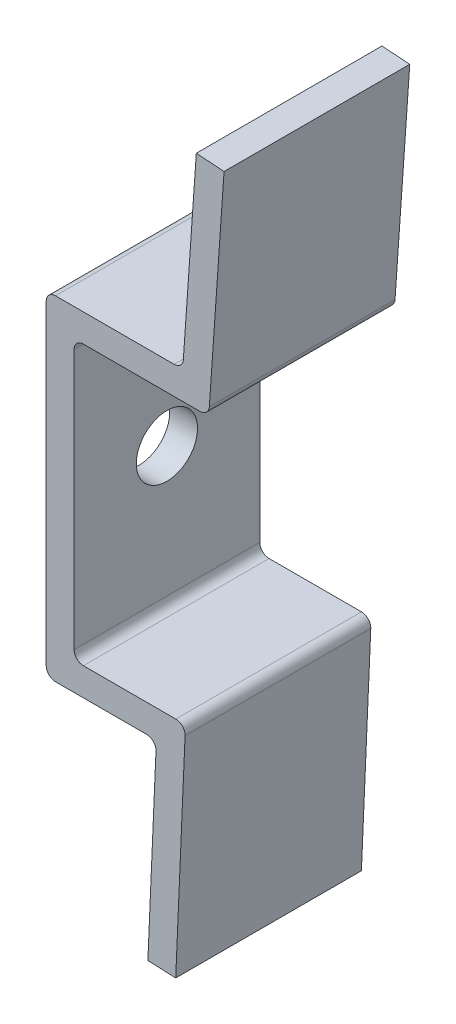
ISO-10303-21;
HEADER;
FILE_DESCRIPTION(('STEP AP214'),'2;1');
FILE_NAME('part.step','',(''),(''),'','','');
FILE_SCHEMA(('AUTOMOTIVE_DESIGN { 1 0 10303 214 1 1 1 1 }'));
ENDSEC;
DATA;
#1=APPLICATION_CONTEXT('core data for automotive mechanical design processes');
#2=APPLICATION_PROTOCOL_DEFINITION('international standard','automotive_design',2000,#1);
#3=PRODUCT_CONTEXT('',#1,'mechanical');
#4=PRODUCT('Part','Part','',(#3));
#5=PRODUCT_RELATED_PRODUCT_CATEGORY('part','',(#4));
#6=PRODUCT_DEFINITION_FORMATION('','',#4);
#7=PRODUCT_DEFINITION_CONTEXT('part definition',#1,'design');
#8=PRODUCT_DEFINITION('design','',#6,#7);
#9=PRODUCT_DEFINITION_SHAPE('','',#8);
#10=(LENGTH_UNIT() NAMED_UNIT(*) SI_UNIT(.MILLI.,.METRE.));
#11=(NAMED_UNIT(*) PLANE_ANGLE_UNIT() SI_UNIT($,.RADIAN.));
#12=(NAMED_UNIT(*) SI_UNIT($,.STERADIAN.) SOLID_ANGLE_UNIT());
#13=UNCERTAINTY_MEASURE_WITH_UNIT(LENGTH_MEASURE(1.E-05),#10,'distance_accuracy_value','');
#14=(GEOMETRIC_REPRESENTATION_CONTEXT(3) GLOBAL_UNCERTAINTY_ASSIGNED_CONTEXT((#13)) GLOBAL_UNIT_ASSIGNED_CONTEXT((#10,
#11,#12)) REPRESENTATION_CONTEXT('',''));
#15=CARTESIAN_POINT('',(0.,0.,0.));
#16=DIRECTION('',(0.,0.,1.));
#17=DIRECTION('',(1.,0.,0.));
#18=AXIS2_PLACEMENT_3D('',#15,#16,#17);
#19=CARTESIAN_POINT('',(10.9482059619883,-39.0245838190026,-9.99999999999998));
#20=DIRECTION('',(-0.0436193873653363,-0.999048221581858,0.));
#21=DIRECTION('',(0.999048221581857,-0.0436193873653405,0.));
#22=AXIS2_PLACEMENT_3D('',#19,#20,#21);
#23=PLANE('',#22);
#24=DIRECTION('',(0.,0.,0.99999999999999));
#25=VECTOR('',#24,1.);
#26=CARTESIAN_POINT('',(13.9453506267337,-39.1554419810987,-10.0000000000002));
#27=LINE('',#26,#25);
#28=CARTESIAN_POINT('',(13.9453506267337,-39.1554419810987,-10.0000000000002));
#29=VERTEX_POINT('',#28);
#30=CARTESIAN_POINT('',(13.9453506267342,-39.1554419810985,9.99999999999976));
#31=VERTEX_POINT('',#30);
#32=EDGE_CURVE('E37',#29,#31,#27,.T.);
#33=ORIENTED_EDGE('',*,*,#32,.T.);
#34=DIRECTION('',(0.999048221581857,-0.0436193873653405,0.));
#35=VECTOR('',#34,1.);
#36=CARTESIAN_POINT('',(10.9482059619881,-39.0245838190023,9.99999999999965));
#37=LINE('',#36,#35);
#38=CARTESIAN_POINT('',(10.9482059619881,-39.0245838190023,9.99999999999965));
#39=VERTEX_POINT('',#38);
#40=EDGE_CURVE('E170',#39,#31,#37,.T.);
#41=ORIENTED_EDGE('',*,*,#40,.F.);
#42=DIRECTION('',(0.,0.,0.99999999999999));
#43=VECTOR('',#42,1.);
#44=CARTESIAN_POINT('',(10.9482059619883,-39.0245838190026,-9.99999999999998));
#45=LINE('',#44,#43);
#46=CARTESIAN_POINT('',(10.9482059619883,-39.0245838190026,-9.99999999999998));
#47=VERTEX_POINT('',#46);
#48=EDGE_CURVE('E11',#47,#39,#45,.T.);
#49=ORIENTED_EDGE('',*,*,#48,.F.);
#50=DIRECTION('',(0.999048221581857,-0.0436193873653405,0.));
#51=VECTOR('',#50,1.);
#52=CARTESIAN_POINT('',(10.9482059619883,-39.0245838190026,-9.99999999999998));
#53=LINE('',#52,#51);
#54=EDGE_CURVE('E171',#47,#29,#53,.T.);
#55=ORIENTED_EDGE('',*,*,#54,.T.);
#56=EDGE_LOOP('',(#33,#41,#49,#55));
#57=FACE_BOUND('',#56,.T.);
#58=ADVANCED_FACE('F34',(#57),#23,.T.);
#59=CARTESIAN_POINT('',(11.8205937092951,-19.0436193873657,-10.0000000000003));
#60=DIRECTION('',(-0.999048221581856,0.0436193873653425,0.));
#61=DIRECTION('',(-0.0436193873653374,-0.999048221581858,0.));
#62=AXIS2_PLACEMENT_3D('',#59,#60,#61);
#63=PLANE('',#62);
#64=ORIENTED_EDGE('',*,*,#48,.T.);
#65=DIRECTION('',(-0.0436193873653374,-0.999048221581858,0.));
#66=VECTOR('',#65,1.);
#67=CARTESIAN_POINT('',(11.8205937092952,-19.0436193873655,9.99999999999954));
#68=LINE('',#67,#66);
#69=CARTESIAN_POINT('',(11.8205937092952,-19.0436193873655,9.99999999999954));
#70=VERTEX_POINT('',#69);
#71=EDGE_CURVE('E188',#70,#39,#68,.T.);
#72=ORIENTED_EDGE('',*,*,#71,.F.);
#73=DIRECTION('',(0.,0.,0.99999999999999));
#74=VECTOR('',#73,1.);
#75=CARTESIAN_POINT('',(11.8205937092951,-19.0436193873657,-10.0000000000003));
#76=LINE('',#75,#74);
#77=CARTESIAN_POINT('',(11.8205937092951,-19.0436193873657,-10.0000000000003));
#78=VERTEX_POINT('',#77);
#79=EDGE_CURVE('E42',#78,#70,#76,.T.);
#80=ORIENTED_EDGE('',*,*,#79,.F.);
#81=DIRECTION('',(-0.0436193873653374,-0.999048221581858,0.));
#82=VECTOR('',#81,1.);
#83=CARTESIAN_POINT('',(11.8205937092951,-19.0436193873657,-10.0000000000003));
#84=LINE('',#83,#82);
#85=EDGE_CURVE('E176',#78,#47,#84,.T.);
#86=ORIENTED_EDGE('',*,*,#85,.T.);
#87=EDGE_LOOP('',(#64,#72,#80,#86));
#88=FACE_BOUND('',#87,.T.);
#89=ADVANCED_FACE('F401',(#88),#63,.T.);
#90=CARTESIAN_POINT('',(10.821545487713,-19.0000000000003,-10.0000000000005));
#91=DIRECTION('',(0.,0.,0.99999999999999));
#92=DIRECTION('',(0.999999999999999,0.,0.));
#93=AXIS2_PLACEMENT_3D('',#90,#91,#92);
#94=CYLINDRICAL_SURFACE('',#93,1.);
#95=ORIENTED_EDGE('',*,*,#79,.T.);
#96=CARTESIAN_POINT('',(10.8215454877133,-19.0000000000001,9.99999999999943));
#97=DIRECTION('',(0.,0.,-0.99999999999999));
#98=DIRECTION('',(-0.999999999999999,0.,0.));
#99=AXIS2_PLACEMENT_3D('',#96,#97,#98);
#100=CIRCLE('',#99,1.);
#101=CARTESIAN_POINT('',(10.8215454877132,-18.0000000000001,9.9999999999992));
#102=VERTEX_POINT('',#101);
#103=EDGE_CURVE('E242',#102,#70,#100,.T.);
#104=ORIENTED_EDGE('',*,*,#103,.F.);
#105=DIRECTION('',(0.,0.,0.99999999999999));
#106=VECTOR('',#105,1.);
#107=CARTESIAN_POINT('',(10.8215454877129,-18.0000000000002,-10.0000000000004));
#108=LINE('',#107,#106);
#109=CARTESIAN_POINT('',(10.8215454877129,-18.0000000000002,-10.0000000000004));
#110=VERTEX_POINT('',#109);
#111=EDGE_CURVE('E300',#110,#102,#108,.T.);
#112=ORIENTED_EDGE('',*,*,#111,.F.);
#113=CARTESIAN_POINT('',(10.821545487713,-19.0000000000003,-10.0000000000005));
#114=DIRECTION('',(0.,0.,-0.99999999999999));
#115=DIRECTION('',(-0.999999999999999,0.,0.));
#116=AXIS2_PLACEMENT_3D('',#113,#114,#115);
#117=CIRCLE('',#116,1.);
#118=EDGE_CURVE('E296',#110,#78,#117,.T.);
#119=ORIENTED_EDGE('',*,*,#118,.T.);
#120=EDGE_LOOP('',(#95,#104,#112,#119));
#121=FACE_BOUND('',#120,.T.);
#122=ADVANCED_FACE('F400',(#121),#94,.F.);
#123=CARTESIAN_POINT('',(1.00000000000067,-18.0000000000004,-10.0000000000005));
#124=DIRECTION('',(0.,-1.,0.));
#125=DIRECTION('',(0.999999999999998,0.,0.));
#126=AXIS2_PLACEMENT_3D('',#123,#124,#125);
#127=PLANE('',#126);
#128=ORIENTED_EDGE('',*,*,#111,.T.);
#129=DIRECTION('',(0.999999999999998,0.,0.));
#130=VECTOR('',#129,1.);
#131=CARTESIAN_POINT('',(1.00000000000056,-18.,9.9999999999997));
#132=LINE('',#131,#130);
#133=CARTESIAN_POINT('',(1.00000000000056,-18.,9.9999999999997));
#134=VERTEX_POINT('',#133);
#135=EDGE_CURVE('E239',#134,#102,#132,.T.);
#136=ORIENTED_EDGE('',*,*,#135,.F.);
#137=DIRECTION('',(0.,0.,0.99999999999999));
#138=VECTOR('',#137,1.);
#139=CARTESIAN_POINT('',(1.00000000000067,-18.0000000000004,-10.0000000000005));
#140=LINE('',#139,#138);
#141=CARTESIAN_POINT('',(1.00000000000067,-18.0000000000004,-10.0000000000005));
#142=VERTEX_POINT('',#141);
#143=EDGE_CURVE('E302',#142,#134,#140,.T.);
#144=ORIENTED_EDGE('',*,*,#143,.F.);
#145=DIRECTION('',(0.999999999999998,0.,0.));
#146=VECTOR('',#145,1.);
#147=CARTESIAN_POINT('',(1.00000000000067,-18.0000000000004,-10.0000000000005));
#148=LINE('',#147,#146);
#149=EDGE_CURVE('E293',#142,#110,#148,.T.);
#150=ORIENTED_EDGE('',*,*,#149,.T.);
#151=EDGE_LOOP('',(#128,#136,#144,#150));
#152=FACE_BOUND('',#151,.T.);
#153=ADVANCED_FACE('F396',(#152),#127,.T.);
#154=CARTESIAN_POINT('',(1.00000000000078,-17.0000000000006,-10.0000000000008));
#155=DIRECTION('',(0.,0.,0.99999999999999));
#156=DIRECTION('',(0.999999999999999,0.,0.));
#157=AXIS2_PLACEMENT_3D('',#154,#155,#156);
#158=CYLINDRICAL_SURFACE('',#157,1.);
#159=ORIENTED_EDGE('',*,*,#143,.T.);
#160=CARTESIAN_POINT('',(1.00000000000039,-17.0000000000001,9.99999999999979));
#161=DIRECTION('',(0.,0.,0.99999999999999));
#162=DIRECTION('',(0.999999999999999,0.,0.));
#163=AXIS2_PLACEMENT_3D('',#160,#161,#162);
#164=CIRCLE('',#163,1.);
#165=CARTESIAN_POINT('',(6.10622663543836E-13,-17.0000000000003,9.99999999999954));
#166=VERTEX_POINT('',#165);
#167=EDGE_CURVE('E236',#166,#134,#164,.T.);
#168=ORIENTED_EDGE('',*,*,#167,.F.);
#169=DIRECTION('',(0.,0.,0.99999999999999));
#170=VECTOR('',#169,1.);
#171=CARTESIAN_POINT('',(3.33066907387547E-13,-17.0000000000003,-10.0000000000002));
#172=LINE('',#171,#170);
#173=CARTESIAN_POINT('',(3.33066907387547E-13,-17.0000000000003,-10.0000000000002));
#174=VERTEX_POINT('',#173);
#175=EDGE_CURVE('E304',#174,#166,#172,.T.);
#176=ORIENTED_EDGE('',*,*,#175,.F.);
#177=CARTESIAN_POINT('',(1.00000000000078,-17.0000000000006,-10.0000000000008));
#178=DIRECTION('',(0.,0.,0.99999999999999));
#179=DIRECTION('',(0.999999999999999,0.,0.));
#180=AXIS2_PLACEMENT_3D('',#177,#178,#179);
#181=CIRCLE('',#180,1.);
#182=EDGE_CURVE('E290',#174,#142,#181,.T.);
#183=ORIENTED_EDGE('',*,*,#182,.T.);
#184=EDGE_LOOP('',(#159,#168,#176,#183));
#185=FACE_BOUND('',#184,.T.);
#186=ADVANCED_FACE('F391',(#185),#158,.T.);
#187=CARTESIAN_POINT('',(2.22044604925031E-13,16.9999999999996,-10.0000000000001));
#188=DIRECTION('',(-0.999999999999998,0.,0.));
#189=DIRECTION('',(0.,-1.,0.));
#190=AXIS2_PLACEMENT_3D('',#187,#188,#189);
#191=PLANE('',#190);
#192=CARTESIAN_POINT('',(0.,0.,0.));
#193=DIRECTION('',(-0.999999999999999,0.,0.));
#194=DIRECTION('',(0.,0.,0.99999999999999));
#195=AXIS2_PLACEMENT_3D('',#192,#193,#194);
#196=CIRCLE('',#195,3.29999999999989);
#197=CARTESIAN_POINT('',(0.,0.,3.29999999999991));
#198=VERTEX_POINT('',#197);
#199=EDGE_CURVE('E192',#198,#198,#196,.T.);
#200=ORIENTED_EDGE('',*,*,#199,.F.);
#201=EDGE_LOOP('',(#200));
#202=FACE_BOUND('',#201,.T.);
#203=ORIENTED_EDGE('',*,*,#175,.T.);
#204=DIRECTION('',(0.,-1.,0.));
#205=VECTOR('',#204,1.);
#206=CARTESIAN_POINT('',(3.88578058618805E-13,16.9999999999991,9.99999999999937));
#207=LINE('',#206,#205);
#208=CARTESIAN_POINT('',(3.88578058618805E-13,16.9999999999991,9.99999999999937));
#209=VERTEX_POINT('',#208);
#210=EDGE_CURVE('E233',#209,#166,#207,.T.);
#211=ORIENTED_EDGE('',*,*,#210,.F.);
#212=DIRECTION('',(0.,0.,0.99999999999999));
#213=VECTOR('',#212,1.);
#214=CARTESIAN_POINT('',(2.22044604925031E-13,16.9999999999996,-10.0000000000001));
#215=LINE('',#214,#213);
#216=CARTESIAN_POINT('',(2.22044604925031E-13,16.9999999999996,-10.0000000000001));
#217=VERTEX_POINT('',#216);
#218=EDGE_CURVE('E306',#217,#209,#215,.T.);
#219=ORIENTED_EDGE('',*,*,#218,.F.);
#220=DIRECTION('',(0.,-1.,0.));
#221=VECTOR('',#220,1.);
#222=CARTESIAN_POINT('',(2.22044604925031E-13,16.9999999999996,-10.0000000000001));
#223=LINE('',#222,#221);
#224=EDGE_CURVE('E287',#217,#174,#223,.T.);
#225=ORIENTED_EDGE('',*,*,#224,.T.);
#226=EDGE_LOOP('',(#203,#211,#219,#225));
#227=FACE_BOUND('',#226,.T.);
#228=ADVANCED_FACE('F389',(#202,#227),#191,.T.);
#229=CARTESIAN_POINT('',(1.00000000000061,16.9999999999998,-10.0000000000004));
#230=DIRECTION('',(0.,0.,0.99999999999999));
#231=DIRECTION('',(0.999999999999999,0.,0.));
#232=AXIS2_PLACEMENT_3D('',#229,#230,#231);
#233=CYLINDRICAL_SURFACE('',#232,1.);
#234=ORIENTED_EDGE('',*,*,#218,.T.);
#235=CARTESIAN_POINT('',(1.00000000000022,16.9999999999995,9.99999999999948));
#236=DIRECTION('',(0.,0.,0.99999999999999));
#237=DIRECTION('',(-0.999999999999999,0.,0.));
#238=AXIS2_PLACEMENT_3D('',#235,#236,#237);
#239=CIRCLE('',#238,1.);
#240=CARTESIAN_POINT('',(1.000000000001,17.9999999999997,9.99999999999943));
#241=VERTEX_POINT('',#240);
#242=EDGE_CURVE('E230',#241,#209,#239,.T.);
#243=ORIENTED_EDGE('',*,*,#242,.F.);
#244=DIRECTION('',(0.,0.,0.99999999999999));
#245=VECTOR('',#244,1.);
#246=CARTESIAN_POINT('',(1.00000000000056,17.9999999999993,-9.99999999999993));
#247=LINE('',#246,#245);
#248=CARTESIAN_POINT('',(1.00000000000056,17.9999999999993,-9.99999999999993));
#249=VERTEX_POINT('',#248);
#250=EDGE_CURVE('E308',#249,#241,#247,.T.);
#251=ORIENTED_EDGE('',*,*,#250,.F.);
#252=CARTESIAN_POINT('',(1.00000000000061,16.9999999999998,-10.0000000000004));
#253=DIRECTION('',(0.,0.,0.99999999999999));
#254=DIRECTION('',(-0.999999999999999,0.,0.));
#255=AXIS2_PLACEMENT_3D('',#252,#253,#254);
#256=CIRCLE('',#255,1.);
#257=EDGE_CURVE('E284',#249,#217,#256,.T.);
#258=ORIENTED_EDGE('',*,*,#257,.T.);
#259=EDGE_LOOP('',(#234,#243,#251,#258));
#260=FACE_BOUND('',#259,.T.);
#261=ADVANCED_FACE('F384',(#260),#233,.T.);
#262=CARTESIAN_POINT('',(13.7699396554494,17.9999999999996,-10.));
#263=DIRECTION('',(0.,1.,0.));
#264=DIRECTION('',(-0.999999999999998,0.,0.));
#265=AXIS2_PLACEMENT_3D('',#262,#263,#264);
#266=PLANE('',#265);
#267=ORIENTED_EDGE('',*,*,#250,.T.);
#268=DIRECTION('',(-0.999999999999998,0.,0.));
#269=VECTOR('',#268,1.);
#270=CARTESIAN_POINT('',(13.76993965545,17.9999999999994,9.99999999999998));
#271=LINE('',#270,#269);
#272=CARTESIAN_POINT('',(13.76993965545,17.9999999999994,9.99999999999998));
#273=VERTEX_POINT('',#272);
#274=EDGE_CURVE('E227',#273,#241,#271,.T.);
#275=ORIENTED_EDGE('',*,*,#274,.F.);
#276=DIRECTION('',(0.,0.,0.99999999999999));
#277=VECTOR('',#276,1.);
#278=CARTESIAN_POINT('',(13.7699396554494,17.9999999999996,-10.));
#279=LINE('',#278,#277);
#280=CARTESIAN_POINT('',(13.7699396554494,17.9999999999996,-10.));
#281=VERTEX_POINT('',#280);
#282=EDGE_CURVE('E310',#281,#273,#279,.T.);
#283=ORIENTED_EDGE('',*,*,#282,.F.);
#284=DIRECTION('',(-0.999999999999998,0.,0.));
#285=VECTOR('',#284,1.);
#286=CARTESIAN_POINT('',(13.7699396554494,17.9999999999996,-10.));
#287=LINE('',#286,#285);
#288=EDGE_CURVE('E281',#281,#249,#287,.T.);
#289=ORIENTED_EDGE('',*,*,#288,.T.);
#290=EDGE_LOOP('',(#267,#275,#283,#289));
#291=FACE_BOUND('',#290,.T.);
#292=ADVANCED_FACE('F379',(#291),#266,.T.);
#293=CARTESIAN_POINT('',(13.7699396554496,18.9999999999997,-10.0000000000001));
#294=DIRECTION('',(0.,0.,0.99999999999999));
#295=DIRECTION('',(0.999999999999999,0.,0.));
#296=AXIS2_PLACEMENT_3D('',#293,#294,#295);
#297=CYLINDRICAL_SURFACE('',#296,0.999999999999999);
#298=ORIENTED_EDGE('',*,*,#282,.T.);
#299=CARTESIAN_POINT('',(13.7699396554496,18.9999999999995,9.99999999999976));
#300=DIRECTION('',(0.,0.,-0.99999999999999));
#301=DIRECTION('',(-0.999999999999999,0.,0.));
#302=AXIS2_PLACEMENT_3D('',#299,#300,#301);
#303=CIRCLE('',#302,0.999999999999999);
#304=CARTESIAN_POINT('',(14.7675037057095,18.9302435262556,9.99999999999993));
#305=VERTEX_POINT('',#304);
#306=EDGE_CURVE('E224',#305,#273,#303,.T.);
#307=ORIENTED_EDGE('',*,*,#306,.F.);
#308=DIRECTION('',(0.,0.,0.99999999999999));
#309=VECTOR('',#308,1.);
#310=CARTESIAN_POINT('',(14.7675037057096,18.9302435262558,-10.0000000000003));
#311=LINE('',#310,#309);
#312=CARTESIAN_POINT('',(14.7675037057096,18.9302435262558,-10.0000000000003));
#313=VERTEX_POINT('',#312);
#314=EDGE_CURVE('E312',#313,#305,#311,.T.);
#315=ORIENTED_EDGE('',*,*,#314,.F.);
#316=CARTESIAN_POINT('',(13.7699396554496,18.9999999999997,-10.0000000000001));
#317=DIRECTION('',(0.,0.,-0.99999999999999));
#318=DIRECTION('',(-0.999999999999999,0.,0.));
#319=AXIS2_PLACEMENT_3D('',#316,#317,#318);
#320=CIRCLE('',#319,0.999999999999999);
#321=EDGE_CURVE('E278',#313,#281,#320,.T.);
#322=ORIENTED_EDGE('',*,*,#321,.T.);
#323=EDGE_LOOP('',(#298,#307,#315,#322));
#324=FACE_BOUND('',#323,.T.);
#325=ADVANCED_FACE('F377',(#324),#297,.F.);
#326=CARTESIAN_POINT('',(16.1626331805919,38.8815245314521,-10.0000000000002));
#327=DIRECTION('',(-0.997564050259823,0.0697564737441239,0.));
#328=DIRECTION('',(-0.0697564737441194,-0.997564050259825,0.));
#329=AXIS2_PLACEMENT_3D('',#326,#327,#328);
#330=PLANE('',#329);
#331=ORIENTED_EDGE('',*,*,#314,.T.);
#332=DIRECTION('',(-0.0697564737441194,-0.997564050259825,0.));
#333=VECTOR('',#332,1.);
#334=CARTESIAN_POINT('',(16.1626331805917,38.8815245314519,9.99999999999976));
#335=LINE('',#334,#333);
#336=CARTESIAN_POINT('',(16.1626331805917,38.8815245314519,9.99999999999976));
#337=VERTEX_POINT('',#336);
#338=EDGE_CURVE('E221',#337,#305,#335,.T.);
#339=ORIENTED_EDGE('',*,*,#338,.F.);
#340=DIRECTION('',(0.,0.,0.99999999999999));
#341=VECTOR('',#340,1.);
#342=CARTESIAN_POINT('',(16.1626331805919,38.8815245314521,-10.0000000000002));
#343=LINE('',#342,#341);
#344=CARTESIAN_POINT('',(16.1626331805919,38.8815245314521,-10.0000000000002));
#345=VERTEX_POINT('',#344);
#346=EDGE_CURVE('E314',#345,#337,#343,.T.);
#347=ORIENTED_EDGE('',*,*,#346,.F.);
#348=DIRECTION('',(-0.0697564737441194,-0.997564050259825,0.));
#349=VECTOR('',#348,1.);
#350=CARTESIAN_POINT('',(16.1626331805919,38.8815245314521,-10.0000000000002));
#351=LINE('',#350,#349);
#352=EDGE_CURVE('E275',#345,#313,#351,.T.);
#353=ORIENTED_EDGE('',*,*,#352,.T.);
#354=EDGE_LOOP('',(#331,#339,#347,#353));
#355=FACE_BOUND('',#354,.T.);
#356=ADVANCED_FACE('F372',(#355),#330,.T.);
#357=CARTESIAN_POINT('',(19.1553253313712,38.67225511022,-10.0000000000001));
#358=DIRECTION('',(0.0697564737441193,0.997564050259825,0.));
#359=DIRECTION('',(-0.997564050259823,0.0697564737441226,0.));
#360=AXIS2_PLACEMENT_3D('',#357,#358,#359);
#361=PLANE('',#360);
#362=ORIENTED_EDGE('',*,*,#346,.T.);
#363=DIRECTION('',(-0.997564050259823,0.0697564737441226,0.));
#364=VECTOR('',#363,1.);
#365=CARTESIAN_POINT('',(19.1553253313712,38.6722551102199,10.));
#366=LINE('',#365,#364);
#367=CARTESIAN_POINT('',(19.1553253313712,38.6722551102199,10.));
#368=VERTEX_POINT('',#367);
#369=EDGE_CURVE('E218',#368,#337,#366,.T.);
#370=ORIENTED_EDGE('',*,*,#369,.F.);
#371=DIRECTION('',(0.,0.,0.99999999999999));
#372=VECTOR('',#371,1.);
#373=CARTESIAN_POINT('',(19.1553253313712,38.67225511022,-10.0000000000001));
#374=LINE('',#373,#372);
#375=CARTESIAN_POINT('',(19.1553253313712,38.67225511022,-10.0000000000001));
#376=VERTEX_POINT('',#375);
#377=EDGE_CURVE('E316',#376,#368,#374,.T.);
#378=ORIENTED_EDGE('',*,*,#377,.F.);
#379=DIRECTION('',(-0.997564050259823,0.0697564737441226,0.));
#380=VECTOR('',#379,1.);
#381=CARTESIAN_POINT('',(19.1553253313712,38.67225511022,-10.0000000000001));
#382=LINE('',#381,#380);
#383=EDGE_CURVE('E272',#376,#345,#382,.T.);
#384=ORIENTED_EDGE('',*,*,#383,.T.);
#385=EDGE_LOOP('',(#362,#370,#378,#384));
#386=FACE_BOUND('',#385,.T.);
#387=ADVANCED_FACE('F367',(#386),#361,.T.);
#388=CARTESIAN_POINT('',(17.565048964122,15.9302435262558,-10.));
#389=DIRECTION('',(0.997564050259823,-0.0697564737441237,0.));
#390=DIRECTION('',(0.0697564737441189,0.997564050259825,0.));
#391=AXIS2_PLACEMENT_3D('',#388,#389,#390);
#392=PLANE('',#391);
#393=ORIENTED_EDGE('',*,*,#377,.T.);
#394=DIRECTION('',(0.0697564737441189,0.997564050259825,0.));
#395=VECTOR('',#394,1.);
#396=CARTESIAN_POINT('',(17.5650489641224,15.9302435262558,9.99999999999959));
#397=LINE('',#396,#395);
#398=CARTESIAN_POINT('',(17.5650489641224,15.9302435262558,9.99999999999959));
#399=VERTEX_POINT('',#398);
#400=EDGE_CURVE('E215',#399,#368,#397,.T.);
#401=ORIENTED_EDGE('',*,*,#400,.F.);
#402=DIRECTION('',(0.,0.,0.99999999999999));
#403=VECTOR('',#402,1.);
#404=CARTESIAN_POINT('',(17.565048964122,15.9302435262558,-10.));
#405=LINE('',#404,#403);
#406=CARTESIAN_POINT('',(17.565048964122,15.9302435262558,-10.));
#407=VERTEX_POINT('',#406);
#408=EDGE_CURVE('E318',#407,#399,#405,.T.);
#409=ORIENTED_EDGE('',*,*,#408,.F.);
#410=DIRECTION('',(0.0697564737441189,0.997564050259825,0.));
#411=VECTOR('',#410,1.);
#412=CARTESIAN_POINT('',(17.565048964122,15.9302435262558,-10.));
#413=LINE('',#412,#411);
#414=EDGE_CURVE('E269',#407,#376,#413,.T.);
#415=ORIENTED_EDGE('',*,*,#414,.T.);
#416=EDGE_LOOP('',(#393,#401,#409,#415));
#417=FACE_BOUND('',#416,.T.);
#418=ADVANCED_FACE('F365',(#417),#392,.T.);
#419=CARTESIAN_POINT('',(16.567484913863,15.9999999999996,-10.0000000000004));
#420=DIRECTION('',(0.,0.,0.99999999999999));
#421=DIRECTION('',(0.999999999999999,0.,0.));
#422=AXIS2_PLACEMENT_3D('',#419,#420,#421);
#423=CYLINDRICAL_SURFACE('',#422,1.);
#424=ORIENTED_EDGE('',*,*,#408,.T.);
#425=CARTESIAN_POINT('',(16.5674849138631,15.9999999999996,9.99999999999959));
#426=DIRECTION('',(0.,0.,0.99999999999999));
#427=DIRECTION('',(0.999999999999999,0.,0.));
#428=AXIS2_PLACEMENT_3D('',#425,#426,#427);
#429=CIRCLE('',#428,1.);
#430=CARTESIAN_POINT('',(16.5674849138627,14.9999999999995,9.99999999999984));
#431=VERTEX_POINT('',#430);
#432=EDGE_CURVE('E212',#431,#399,#429,.T.);
#433=ORIENTED_EDGE('',*,*,#432,.F.);
#434=DIRECTION('',(0.,0.,0.99999999999999));
#435=VECTOR('',#434,1.);
#436=CARTESIAN_POINT('',(16.5674849138628,14.9999999999996,-10.0000000000005));
#437=LINE('',#436,#435);
#438=CARTESIAN_POINT('',(16.5674849138628,14.9999999999996,-10.0000000000005));
#439=VERTEX_POINT('',#438);
#440=EDGE_CURVE('E320',#439,#431,#437,.T.);
#441=ORIENTED_EDGE('',*,*,#440,.F.);
#442=CARTESIAN_POINT('',(16.567484913863,15.9999999999996,-10.0000000000004));
#443=DIRECTION('',(0.,0.,0.99999999999999));
#444=DIRECTION('',(0.999999999999999,0.,0.));
#445=AXIS2_PLACEMENT_3D('',#442,#443,#444);
#446=CIRCLE('',#445,1.);
#447=EDGE_CURVE('E266',#439,#407,#446,.T.);
#448=ORIENTED_EDGE('',*,*,#447,.T.);
#449=EDGE_LOOP('',(#424,#433,#441,#448));
#450=FACE_BOUND('',#449,.T.);
#451=ADVANCED_FACE('F360',(#450),#423,.T.);
#452=CARTESIAN_POINT('',(4.00000000000039,14.9999999999999,-10.0000000000006));
#453=DIRECTION('',(0.,-1.,0.));
#454=DIRECTION('',(0.,0.,-0.99999999999999));
#455=AXIS2_PLACEMENT_3D('',#452,#453,#454);
#456=PLANE('',#455);
#457=ORIENTED_EDGE('',*,*,#440,.T.);
#458=DIRECTION('',(0.999999999999999,0.,0.));
#459=VECTOR('',#458,1.);
#460=CARTESIAN_POINT('',(4.00000000000011,14.9999999999996,9.99999999999948));
#461=LINE('',#460,#459);
#462=CARTESIAN_POINT('',(4.00000000000011,14.9999999999996,9.99999999999948));
#463=VERTEX_POINT('',#462);
#464=EDGE_CURVE('E209',#463,#431,#461,.T.);
#465=ORIENTED_EDGE('',*,*,#464,.F.);
#466=DIRECTION('',(0.,0.,0.99999999999999));
#467=VECTOR('',#466,1.);
#468=CARTESIAN_POINT('',(4.00000000000039,14.9999999999999,-10.0000000000006));
#469=LINE('',#468,#467);
#470=CARTESIAN_POINT('',(4.00000000000039,14.9999999999999,-10.0000000000006));
#471=VERTEX_POINT('',#470);
#472=EDGE_CURVE('E322',#471,#463,#469,.T.);
#473=ORIENTED_EDGE('',*,*,#472,.F.);
#474=DIRECTION('',(0.999999999999999,0.,0.));
#475=VECTOR('',#474,1.);
#476=CARTESIAN_POINT('',(4.00000000000039,14.9999999999999,-10.0000000000006));
#477=LINE('',#476,#475);
#478=EDGE_CURVE('E263',#471,#439,#477,.T.);
#479=ORIENTED_EDGE('',*,*,#478,.T.);
#480=EDGE_LOOP('',(#457,#465,#473,#479));
#481=FACE_BOUND('',#480,.T.);
#482=ADVANCED_FACE('F355',(#481),#456,.T.);
#483=CARTESIAN_POINT('',(4.00000000000028,13.9999999999994,-10.0000000000002));
#484=DIRECTION('',(0.,0.,0.99999999999999));
#485=DIRECTION('',(0.999999999999999,0.,0.));
#486=AXIS2_PLACEMENT_3D('',#483,#484,#485);
#487=CYLINDRICAL_SURFACE('',#486,0.999999999999999);
#488=ORIENTED_EDGE('',*,*,#472,.T.);
#489=CARTESIAN_POINT('',(4.,13.9999999999999,9.99999999999979));
#490=DIRECTION('',(0.,0.,-0.99999999999999));
#491=DIRECTION('',(-0.999999999999999,0.,0.));
#492=AXIS2_PLACEMENT_3D('',#489,#490,#491);
#493=CIRCLE('',#492,0.999999999999999);
#494=CARTESIAN_POINT('',(3.00000000000056,13.9999999999997,9.9999999999999));
#495=VERTEX_POINT('',#494);
#496=EDGE_CURVE('E206',#495,#463,#493,.T.);
#497=ORIENTED_EDGE('',*,*,#496,.F.);
#498=DIRECTION('',(0.,0.,0.99999999999999));
#499=VECTOR('',#498,1.);
#500=CARTESIAN_POINT('',(3.00000000000067,13.9999999999997,-10.0000000000003));
#501=LINE('',#500,#499);
#502=CARTESIAN_POINT('',(3.00000000000067,13.9999999999997,-10.0000000000003));
#503=VERTEX_POINT('',#502);
#504=EDGE_CURVE('E324',#503,#495,#501,.T.);
#505=ORIENTED_EDGE('',*,*,#504,.F.);
#506=CARTESIAN_POINT('',(4.00000000000028,13.9999999999994,-10.0000000000002));
#507=DIRECTION('',(0.,0.,-0.99999999999999));
#508=DIRECTION('',(-0.999999999999999,0.,0.));
#509=AXIS2_PLACEMENT_3D('',#506,#507,#508);
#510=CIRCLE('',#509,0.999999999999999);
#511=EDGE_CURVE('E260',#503,#471,#510,.T.);
#512=ORIENTED_EDGE('',*,*,#511,.T.);
#513=EDGE_LOOP('',(#488,#497,#505,#512));
#514=FACE_BOUND('',#513,.T.);
#515=ADVANCED_FACE('F353',(#514),#487,.F.);
#516=CARTESIAN_POINT('',(3.00000000000022,-13.9999999999999,-10.0000000000006));
#517=DIRECTION('',(0.999999999999999,0.,0.));
#518=DIRECTION('',(0.,0.,-0.99999999999999));
#519=AXIS2_PLACEMENT_3D('',#516,#517,#518);
#520=PLANE('',#519);
#521=CARTESIAN_POINT('',(3.00000000000045,0.,-6.93889390390723E-13));
#522=DIRECTION('',(0.999999999999999,0.,0.));
#523=DIRECTION('',(0.,0.,-0.99999999999999));
#524=AXIS2_PLACEMENT_3D('',#521,#522,#523);
#525=CIRCLE('',#524,3.29999999999994);
#526=CARTESIAN_POINT('',(3.00000000000045,0.,3.29999999999991));
#527=VERTEX_POINT('',#526);
#528=EDGE_CURVE('E189',#527,#527,#525,.T.);
#529=ORIENTED_EDGE('',*,*,#528,.F.);
#530=EDGE_LOOP('',(#529));
#531=FACE_BOUND('',#530,.T.);
#532=ORIENTED_EDGE('',*,*,#504,.T.);
#533=DIRECTION('',(0.,1.,0.));
#534=VECTOR('',#533,1.);
#535=CARTESIAN_POINT('',(3.0000000000005,-14.0000000000004,9.99999999999912));
#536=LINE('',#535,#534);
#537=CARTESIAN_POINT('',(3.0000000000005,-14.0000000000004,9.99999999999912));
#538=VERTEX_POINT('',#537);
#539=EDGE_CURVE('E203',#538,#495,#536,.T.);
#540=ORIENTED_EDGE('',*,*,#539,.F.);
#541=DIRECTION('',(0.,0.,0.99999999999999));
#542=VECTOR('',#541,1.);
#543=CARTESIAN_POINT('',(3.00000000000022,-13.9999999999999,-10.0000000000006));
#544=LINE('',#543,#542);
#545=CARTESIAN_POINT('',(3.00000000000022,-13.9999999999999,-10.0000000000006));
#546=VERTEX_POINT('',#545);
#547=EDGE_CURVE('E326',#546,#538,#544,.T.);
#548=ORIENTED_EDGE('',*,*,#547,.F.);
#549=DIRECTION('',(0.,1.,0.));
#550=VECTOR('',#549,1.);
#551=CARTESIAN_POINT('',(3.00000000000022,-13.9999999999999,-10.0000000000006));
#552=LINE('',#551,#550);
#553=EDGE_CURVE('E257',#546,#503,#552,.T.);
#554=ORIENTED_EDGE('',*,*,#553,.T.);
#555=EDGE_LOOP('',(#532,#540,#548,#554));
#556=FACE_BOUND('',#555,.T.);
#557=ADVANCED_FACE('F348',(#531,#556),#520,.T.);
#558=CARTESIAN_POINT('',(4.00000000000089,-14.0000000000004,-10.0000000000003));
#559=DIRECTION('',(0.,0.,0.99999999999999));
#560=DIRECTION('',(0.999999999999999,0.,0.));
#561=AXIS2_PLACEMENT_3D('',#558,#559,#560);
#562=CYLINDRICAL_SURFACE('',#561,0.999999999999999);
#563=ORIENTED_EDGE('',*,*,#547,.T.);
#564=CARTESIAN_POINT('',(4.00000000000045,-14.0000000000004,9.99999999999937));
#565=DIRECTION('',(0.,0.,-0.99999999999999));
#566=DIRECTION('',(-0.999999999999999,0.,0.));
#567=AXIS2_PLACEMENT_3D('',#564,#565,#566);
#568=CIRCLE('',#567,0.999999999999999);
#569=CARTESIAN_POINT('',(4.00000000000034,-15.0000000000002,9.99999999999923));
#570=VERTEX_POINT('',#569);
#571=EDGE_CURVE('E200',#570,#538,#568,.T.);
#572=ORIENTED_EDGE('',*,*,#571,.F.);
#573=DIRECTION('',(0.,0.,0.99999999999999));
#574=VECTOR('',#573,1.);
#575=CARTESIAN_POINT('',(4.00000000000067,-15.0000000000003,-10.0000000000005));
#576=LINE('',#575,#574);
#577=CARTESIAN_POINT('',(4.00000000000067,-15.0000000000003,-10.0000000000005));
#578=VERTEX_POINT('',#577);
#579=EDGE_CURVE('E328',#578,#570,#576,.T.);
#580=ORIENTED_EDGE('',*,*,#579,.F.);
#581=CARTESIAN_POINT('',(4.00000000000089,-14.0000000000004,-10.0000000000003));
#582=DIRECTION('',(0.,0.,-0.99999999999999));
#583=DIRECTION('',(-0.999999999999999,0.,0.));
#584=AXIS2_PLACEMENT_3D('',#581,#582,#583);
#585=CIRCLE('',#584,0.999999999999999);
#586=EDGE_CURVE('E254',#578,#546,#585,.T.);
#587=ORIENTED_EDGE('',*,*,#586,.T.);
#588=EDGE_LOOP('',(#563,#572,#580,#587));
#589=FACE_BOUND('',#588,.T.);
#590=ADVANCED_FACE('F341',(#589),#562,.F.);
#591=CARTESIAN_POINT('',(13.9553863719287,-15.0000000000005,-10.0000000000006));
#592=DIRECTION('',(0.,1.,0.));
#593=DIRECTION('',(-0.999999999999998,0.,0.));
#594=AXIS2_PLACEMENT_3D('',#591,#592,#593);
#595=PLANE('',#594);
#596=ORIENTED_EDGE('',*,*,#579,.T.);
#597=DIRECTION('',(-0.999999999999998,0.,0.));
#598=VECTOR('',#597,1.);
#599=CARTESIAN_POINT('',(13.9553863719286,-15.0000000000002,9.99999999999954));
#600=LINE('',#599,#598);
#601=CARTESIAN_POINT('',(13.9553863719286,-15.0000000000002,9.99999999999954));
#602=VERTEX_POINT('',#601);
#603=EDGE_CURVE('E197',#602,#570,#600,.T.);
#604=ORIENTED_EDGE('',*,*,#603,.F.);
#605=DIRECTION('',(0.,0.,0.99999999999999));
#606=VECTOR('',#605,1.);
#607=CARTESIAN_POINT('',(13.9553863719287,-15.0000000000005,-10.0000000000006));
#608=LINE('',#607,#606);
#609=CARTESIAN_POINT('',(13.9553863719287,-15.0000000000005,-10.0000000000006));
#610=VERTEX_POINT('',#609);
#611=EDGE_CURVE('E330',#610,#602,#608,.T.);
#612=ORIENTED_EDGE('',*,*,#611,.F.);
#613=DIRECTION('',(-0.999999999999998,0.,0.));
#614=VECTOR('',#613,1.);
#615=CARTESIAN_POINT('',(13.9553863719287,-15.0000000000005,-10.0000000000006));
#616=LINE('',#615,#614);
#617=EDGE_CURVE('E251',#610,#578,#616,.T.);
#618=ORIENTED_EDGE('',*,*,#617,.T.);
#619=EDGE_LOOP('',(#596,#604,#612,#618));
#620=FACE_BOUND('',#619,.T.);
#621=ADVANCED_FACE('F338',(#620),#595,.T.);
#622=CARTESIAN_POINT('',(13.9553863719288,-16.0000000000007,-10.0000000000003));
#623=DIRECTION('',(0.,0.,0.99999999999999));
#624=DIRECTION('',(0.999999999999999,0.,0.));
#625=AXIS2_PLACEMENT_3D('',#622,#623,#624);
#626=CYLINDRICAL_SURFACE('',#625,1.);
#627=ORIENTED_EDGE('',*,*,#611,.T.);
#628=CARTESIAN_POINT('',(13.9553863719287,-16.0000000000001,9.99999999999954));
#629=DIRECTION('',(0.,0.,0.99999999999999));
#630=DIRECTION('',(0.999999999999999,0.,0.));
#631=AXIS2_PLACEMENT_3D('',#628,#629,#630);
#632=CIRCLE('',#631,1.);
#633=CARTESIAN_POINT('',(14.9544345935106,-16.0436193873658,9.99999999999926));
#634=VERTEX_POINT('',#633);
#635=EDGE_CURVE('E183',#634,#602,#632,.T.);
#636=ORIENTED_EDGE('',*,*,#635,.F.);
#637=DIRECTION('',(0.,0.,0.99999999999999));
#638=VECTOR('',#637,1.);
#639=CARTESIAN_POINT('',(14.9544345935108,-16.0436193873658,-10.0000000000003));
#640=LINE('',#639,#638);
#641=CARTESIAN_POINT('',(14.9544345935108,-16.0436193873658,-10.0000000000003));
#642=VERTEX_POINT('',#641);
#643=EDGE_CURVE('E175',#642,#634,#640,.T.);
#644=ORIENTED_EDGE('',*,*,#643,.F.);
#645=CARTESIAN_POINT('',(13.9553863719288,-16.0000000000007,-10.0000000000003));
#646=DIRECTION('',(0.,0.,0.99999999999999));
#647=DIRECTION('',(0.999999999999999,0.,0.));
#648=AXIS2_PLACEMENT_3D('',#645,#646,#647);
#649=CIRCLE('',#648,1.);
#650=EDGE_CURVE('E248',#642,#610,#649,.T.);
#651=ORIENTED_EDGE('',*,*,#650,.T.);
#652=EDGE_LOOP('',(#627,#636,#644,#651));
#653=FACE_BOUND('',#652,.T.);
#654=ADVANCED_FACE('F332',(#653),#626,.T.);
#655=CARTESIAN_POINT('',(13.9453506267337,-39.1554419810987,-10.0000000000002));
#656=DIRECTION('',(0.999048221581857,-0.043619387365341,0.));
#657=DIRECTION('',(0.0436193873653382,0.999048221581859,0.));
#658=AXIS2_PLACEMENT_3D('',#655,#656,#657);
#659=PLANE('',#658);
#660=ORIENTED_EDGE('',*,*,#643,.T.);
#661=DIRECTION('',(0.0436193873653382,0.999048221581859,0.));
#662=VECTOR('',#661,1.);
#663=CARTESIAN_POINT('',(13.9453506267342,-39.1554419810985,9.99999999999976));
#664=LINE('',#663,#662);
#665=EDGE_CURVE('E178',#31,#634,#664,.T.);
#666=ORIENTED_EDGE('',*,*,#665,.F.);
#667=ORIENTED_EDGE('',*,*,#32,.F.);
#668=DIRECTION('',(0.0436193873653382,0.999048221581859,0.));
#669=VECTOR('',#668,1.);
#670=CARTESIAN_POINT('',(13.9453506267337,-39.1554419810987,-10.0000000000002));
#671=LINE('',#670,#669);
#672=EDGE_CURVE('E246',#29,#642,#671,.T.);
#673=ORIENTED_EDGE('',*,*,#672,.T.);
#674=EDGE_LOOP('',(#660,#666,#667,#673));
#675=FACE_BOUND('',#674,.T.);
#676=ADVANCED_FACE('F179',(#675),#659,.T.);
#677=CARTESIAN_POINT('',(13.9553863719288,-16.0000000000007,-10.0000000000003));
#678=DIRECTION('',(0.,0.,0.99999999999999));
#679=DIRECTION('',(0.999999999999999,0.,0.));
#680=AXIS2_PLACEMENT_3D('',#677,#678,#679);
#681=PLANE('',#680);
#682=ORIENTED_EDGE('',*,*,#54,.F.);
#683=ORIENTED_EDGE('',*,*,#85,.F.);
#684=ORIENTED_EDGE('',*,*,#118,.F.);
#685=ORIENTED_EDGE('',*,*,#149,.F.);
#686=ORIENTED_EDGE('',*,*,#182,.F.);
#687=ORIENTED_EDGE('',*,*,#224,.F.);
#688=ORIENTED_EDGE('',*,*,#257,.F.);
#689=ORIENTED_EDGE('',*,*,#288,.F.);
#690=ORIENTED_EDGE('',*,*,#321,.F.);
#691=ORIENTED_EDGE('',*,*,#352,.F.);
#692=ORIENTED_EDGE('',*,*,#383,.F.);
#693=ORIENTED_EDGE('',*,*,#414,.F.);
#694=ORIENTED_EDGE('',*,*,#447,.F.);
#695=ORIENTED_EDGE('',*,*,#478,.F.);
#696=ORIENTED_EDGE('',*,*,#511,.F.);
#697=ORIENTED_EDGE('',*,*,#553,.F.);
#698=ORIENTED_EDGE('',*,*,#586,.F.);
#699=ORIENTED_EDGE('',*,*,#617,.F.);
#700=ORIENTED_EDGE('',*,*,#650,.F.);
#701=ORIENTED_EDGE('',*,*,#672,.F.);
#702=EDGE_LOOP('',(#682,#683,#684,#685,#686,#687,#688,#689,#690,#691,#692,#693,#694,#695,#696,
#697,#698,#699,#700,#701));
#703=FACE_BOUND('',#702,.T.);
#704=ADVANCED_FACE('F344',(#703),#681,.F.);
#705=CARTESIAN_POINT('',(13.9553863719287,-16.0000000000001,9.99999999999954));
#706=DIRECTION('',(0.,0.,0.99999999999999));
#707=DIRECTION('',(0.999999999999999,0.,0.));
#708=AXIS2_PLACEMENT_3D('',#705,#706,#707);
#709=PLANE('',#708);
#710=ORIENTED_EDGE('',*,*,#40,.T.);
#711=ORIENTED_EDGE('',*,*,#665,.T.);
#712=ORIENTED_EDGE('',*,*,#635,.T.);
#713=ORIENTED_EDGE('',*,*,#603,.T.);
#714=ORIENTED_EDGE('',*,*,#571,.T.);
#715=ORIENTED_EDGE('',*,*,#539,.T.);
#716=ORIENTED_EDGE('',*,*,#496,.T.);
#717=ORIENTED_EDGE('',*,*,#464,.T.);
#718=ORIENTED_EDGE('',*,*,#432,.T.);
#719=ORIENTED_EDGE('',*,*,#400,.T.);
#720=ORIENTED_EDGE('',*,*,#369,.T.);
#721=ORIENTED_EDGE('',*,*,#338,.T.);
#722=ORIENTED_EDGE('',*,*,#306,.T.);
#723=ORIENTED_EDGE('',*,*,#274,.T.);
#724=ORIENTED_EDGE('',*,*,#242,.T.);
#725=ORIENTED_EDGE('',*,*,#210,.T.);
#726=ORIENTED_EDGE('',*,*,#167,.T.);
#727=ORIENTED_EDGE('',*,*,#135,.T.);
#728=ORIENTED_EDGE('',*,*,#103,.T.);
#729=ORIENTED_EDGE('',*,*,#71,.T.);
#730=EDGE_LOOP('',(#710,#711,#712,#713,#714,#715,#716,#717,#718,#719,#720,#721,#722,#723,#724,
#725,#726,#727,#728,#729));
#731=FACE_BOUND('',#730,.T.);
#732=ADVANCED_FACE('F186',(#731),#709,.T.);
#733=CARTESIAN_POINT('',(0.,0.,0.));
#734=DIRECTION('',(-0.999999999999999,0.,0.));
#735=DIRECTION('',(0.,0.,0.99999999999999));
#736=AXIS2_PLACEMENT_3D('',#733,#734,#735);
#737=CYLINDRICAL_SURFACE('',#736,3.29999999999994);
#738=CARTESIAN_POINT('',(3.00000000000045,0.,3.29999999999991));
#739=CARTESIAN_POINT('',(2.96875000000044,0.,3.29999999999991));
#740=CARTESIAN_POINT('',(2.93750000000044,0.,3.29999999999991));
#741=CARTESIAN_POINT('',(2.87500000000043,0.,3.29999999999991));
#742=CARTESIAN_POINT('',(2.84375000000042,0.,3.29999999999991));
#743=CARTESIAN_POINT('',(2.78125000000041,0.,3.29999999999991));
#744=CARTESIAN_POINT('',(2.75000000000041,0.,3.29999999999991));
#745=CARTESIAN_POINT('',(2.6875000000004,0.,3.29999999999991));
#746=CARTESIAN_POINT('',(2.65625000000039,0.,3.29999999999991));
#747=CARTESIAN_POINT('',(2.59375000000039,0.,3.29999999999991));
#748=CARTESIAN_POINT('',(2.56250000000038,0.,3.29999999999991));
#749=CARTESIAN_POINT('',(2.50000000000037,0.,3.29999999999991));
#750=CARTESIAN_POINT('',(2.46875000000037,0.,3.29999999999991));
#751=CARTESIAN_POINT('',(2.40625000000036,0.,3.29999999999991));
#752=CARTESIAN_POINT('',(2.37500000000035,0.,3.29999999999991));
#753=CARTESIAN_POINT('',(2.31250000000034,0.,3.29999999999991));
#754=CARTESIAN_POINT('',(2.28125000000034,0.,3.29999999999991));
#755=CARTESIAN_POINT('',(2.21875000000033,0.,3.29999999999991));
#756=CARTESIAN_POINT('',(2.18750000000033,0.,3.29999999999991));
#757=CARTESIAN_POINT('',(2.12500000000032,0.,3.29999999999991));
#758=CARTESIAN_POINT('',(2.09375000000031,0.,3.29999999999991));
#759=CARTESIAN_POINT('',(2.0312500000003,0.,3.29999999999991));
#760=CARTESIAN_POINT('',(2.0000000000003,0.,3.29999999999991));
#761=CARTESIAN_POINT('',(1.93750000000029,0.,3.29999999999991));
#762=CARTESIAN_POINT('',(1.90625000000028,0.,3.29999999999991));
#763=CARTESIAN_POINT('',(1.84375000000027,0.,3.29999999999991));
#764=CARTESIAN_POINT('',(1.81250000000027,0.,3.29999999999991));
#765=CARTESIAN_POINT('',(1.75000000000026,0.,3.29999999999991));
#766=CARTESIAN_POINT('',(1.71875000000025,0.,3.29999999999991));
#767=CARTESIAN_POINT('',(1.65625000000025,0.,3.29999999999991));
#768=CARTESIAN_POINT('',(1.62500000000024,0.,3.29999999999991));
#769=CARTESIAN_POINT('',(1.56250000000023,0.,3.29999999999991));
#770=CARTESIAN_POINT('',(1.53125000000023,0.,3.29999999999991));
#771=CARTESIAN_POINT('',(1.46875000000022,0.,3.29999999999991));
#772=CARTESIAN_POINT('',(1.43750000000021,0.,3.29999999999991));
#773=CARTESIAN_POINT('',(1.3750000000002,0.,3.29999999999991));
#774=CARTESIAN_POINT('',(1.3437500000002,0.,3.29999999999991));
#775=CARTESIAN_POINT('',(1.28125000000019,0.,3.29999999999991));
#776=CARTESIAN_POINT('',(1.25000000000019,0.,3.29999999999991));
#777=CARTESIAN_POINT('',(1.18750000000018,0.,3.29999999999991));
#778=CARTESIAN_POINT('',(1.15625000000017,0.,3.29999999999991));
#779=CARTESIAN_POINT('',(1.09375000000016,0.,3.29999999999991));
#780=CARTESIAN_POINT('',(1.06250000000016,0.,3.29999999999991));
#781=CARTESIAN_POINT('',(1.00000000000015,0.,3.29999999999991));
#782=CARTESIAN_POINT('',(0.968750000000143,0.,3.29999999999991));
#783=CARTESIAN_POINT('',(0.906250000000134,0.,3.29999999999991));
#784=CARTESIAN_POINT('',(0.87500000000013,0.,3.29999999999991));
#785=CARTESIAN_POINT('',(0.81250000000012,0.,3.29999999999991));
#786=CARTESIAN_POINT('',(0.781250000000115,0.,3.29999999999991));
#787=CARTESIAN_POINT('',(0.718750000000106,0.,3.29999999999991));
#788=CARTESIAN_POINT('',(0.687500000000101,0.,3.29999999999991));
#789=CARTESIAN_POINT('',(0.625000000000092,0.,3.29999999999991));
#790=CARTESIAN_POINT('',(0.593750000000088,0.,3.29999999999991));
#791=CARTESIAN_POINT('',(0.531250000000078,0.,3.29999999999991));
#792=CARTESIAN_POINT('',(0.500000000000073,0.,3.29999999999991));
#793=CARTESIAN_POINT('',(0.437500000000064,0.,3.29999999999991));
#794=CARTESIAN_POINT('',(0.40625000000006,0.,3.29999999999991));
#795=CARTESIAN_POINT('',(0.34375000000005,0.,3.29999999999991));
#796=CARTESIAN_POINT('',(0.312500000000046,0.,3.29999999999991));
#797=CARTESIAN_POINT('',(0.250000000000036,0.,3.29999999999991));
#798=CARTESIAN_POINT('',(0.218750000000032,0.,3.29999999999991));
#799=CARTESIAN_POINT('',(0.156250000000022,0.,3.29999999999991));
#800=CARTESIAN_POINT('',(0.125000000000018,0.,3.29999999999991));
#801=CARTESIAN_POINT('',(0.0625000000000084,0.,3.29999999999991));
#802=CARTESIAN_POINT('',(0.0312500000000038,0.,3.29999999999991));
#803=CARTESIAN_POINT('',(0.,0.,3.29999999999991));
#804=B_SPLINE_CURVE_WITH_KNOTS('',3,(#738,#739,#740,#741,#742,#743,#744,#745,#746,#747,#748,
#749,#750,#751,#752,#753,#754,#755,#756,#757,#758,#759,#760,#761,#762,#763,#764,#765,#766,#767,
#768,#769,#770,#771,#772,#773,#774,#775,#776,#777,#778,#779,#780,#781,#782,#783,#784,#785,#786,
#787,#788,#789,#790,#791,#792,#793,#794,#795,#796,#797,#798,#799,#800,#801,#802,#803),
.UNSPECIFIED.,.F.,.F.,(4,2,2,2,2,2,2,2,2,2,2,2,2,2,2,2,2,2,2,2,2,2,2,2,2,2,2,2,2,2,2,2,4),(0.,
0.093750000000014,0.187500000000028,0.281250000000042,0.375000000000056,0.46875000000007,
0.562500000000084,0.656250000000098,0.750000000000112,0.843750000000126,0.93750000000014,
1.03125000000015,1.12500000000017,1.21875000000018,1.3125000000002,1.40625000000021,
1.50000000000022,1.59375000000024,1.68750000000025,1.78125000000027,1.87500000000028,
1.96875000000029,2.06250000000031,2.15625000000032,2.25000000000034,2.34375000000035,
2.43750000000036,2.53125000000038,2.62500000000039,2.71875000000041,2.81250000000042,
2.90625000000043,3.00000000000045),.UNSPECIFIED.);
#805=EDGE_CURVE('BSEAM452',#527,#198,#804,.T.);
#806=ORIENTED_EDGE('',*,*,#528,.T.);
#807=ORIENTED_EDGE('',*,*,#199,.T.);
#808=ORIENTED_EDGE('',*,*,#805,.T.);
#809=ORIENTED_EDGE('',*,*,#805,.F.);
#810=EDGE_LOOP('',(#806,#808,#807,#809));
#811=FACE_BOUND('',#810,.T.);
#812=ADVANCED_FACE('F452',(#811),#737,.F.);
#813=CLOSED_SHELL('',(#58,#89,#122,#153,#186,#228,#261,#292,#325,#356,#387,#418,#451,#482,#515,
#557,#590,#621,#654,#676,#704,#732,#812));
#814=MANIFOLD_SOLID_BREP('B2',#813);
#815=ADVANCED_BREP_SHAPE_REPRESENTATION('',(#18,#814),#14);
#816=SHAPE_DEFINITION_REPRESENTATION(#9,#815);
ENDSEC;
END-ISO-10303-21;
